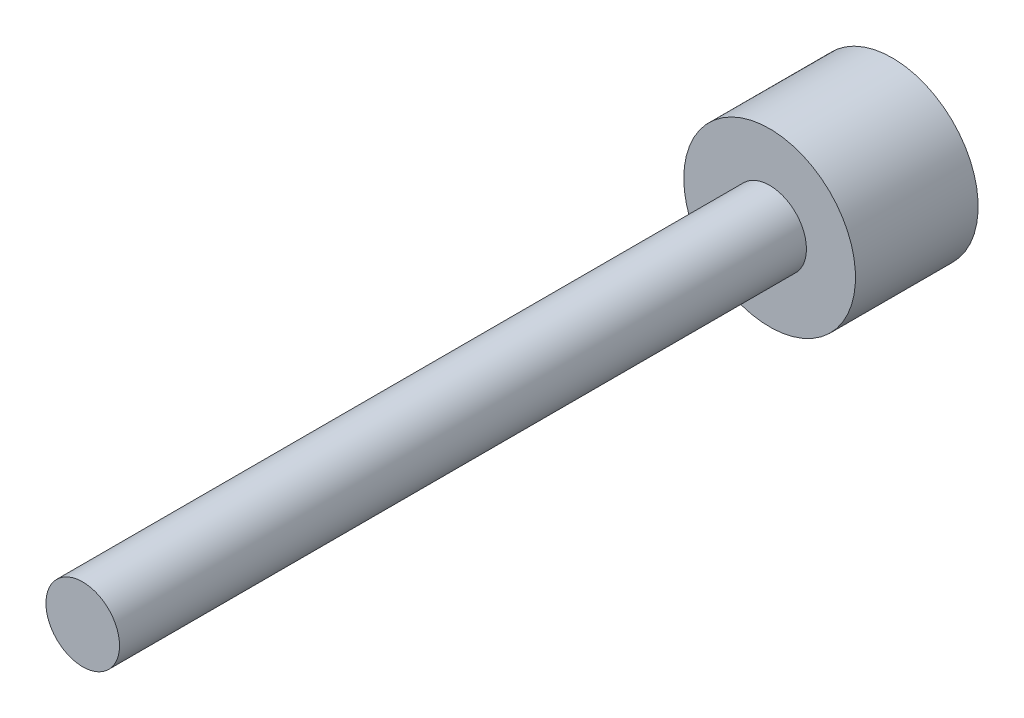
ISO-10303-21;
HEADER;
FILE_DESCRIPTION(('STEP AP214'),'2;1');
FILE_NAME('part.step','',(''),(''),'','','');
FILE_SCHEMA(('AUTOMOTIVE_DESIGN { 1 0 10303 214 1 1 1 1 }'));
ENDSEC;
DATA;
#1=APPLICATION_CONTEXT('core data for automotive mechanical design processes');
#2=APPLICATION_PROTOCOL_DEFINITION('international standard','automotive_design',2000,#1);
#3=PRODUCT_CONTEXT('',#1,'mechanical');
#4=PRODUCT('Part','Part','',(#3));
#5=PRODUCT_RELATED_PRODUCT_CATEGORY('part','',(#4));
#6=PRODUCT_DEFINITION_FORMATION('','',#4);
#7=PRODUCT_DEFINITION_CONTEXT('part definition',#1,'design');
#8=PRODUCT_DEFINITION('design','',#6,#7);
#9=PRODUCT_DEFINITION_SHAPE('','',#8);
#10=(LENGTH_UNIT() NAMED_UNIT(*) SI_UNIT(.MILLI.,.METRE.));
#11=(NAMED_UNIT(*) PLANE_ANGLE_UNIT() SI_UNIT($,.RADIAN.));
#12=(NAMED_UNIT(*) SI_UNIT($,.STERADIAN.) SOLID_ANGLE_UNIT());
#13=UNCERTAINTY_MEASURE_WITH_UNIT(LENGTH_MEASURE(1.E-05),#10,'distance_accuracy_value','');
#14=(GEOMETRIC_REPRESENTATION_CONTEXT(3) GLOBAL_UNCERTAINTY_ASSIGNED_CONTEXT((#13)) GLOBAL_UNIT_ASSIGNED_CONTEXT((#10,
#11,#12)) REPRESENTATION_CONTEXT('',''));
#15=CARTESIAN_POINT('',(0.,0.,0.));
#16=DIRECTION('',(0.,0.,1.));
#17=DIRECTION('',(1.,0.,0.));
#18=AXIS2_PLACEMENT_3D('',#15,#16,#17);
#19=CARTESIAN_POINT('',(0.,0.,28.));
#20=DIRECTION('',(0.,0.,-1.));
#21=DIRECTION('',(-1.,0.,0.));
#22=AXIS2_PLACEMENT_3D('',#19,#20,#21);
#23=CYLINDRICAL_SURFACE('',#22,1.5);
#24=CARTESIAN_POINT('',(0.,0.,28.));
#25=DIRECTION('',(0.,0.,1.));
#26=DIRECTION('',(1.,0.,0.));
#27=AXIS2_PLACEMENT_3D('',#24,#25,#26);
#28=CIRCLE('',#27,1.5);
#29=CARTESIAN_POINT('',(1.5,0.,28.));
#30=VERTEX_POINT('',#29);
#31=EDGE_CURVE('E10',#30,#30,#28,.T.);
#32=ORIENTED_EDGE('',*,*,#31,.F.);
#33=EDGE_LOOP('',(#32));
#34=FACE_BOUND('',#33,.T.);
#35=CARTESIAN_POINT('',(0.,0.,0.));
#36=DIRECTION('',(0.,0.,1.));
#37=DIRECTION('',(1.,0.,0.));
#38=AXIS2_PLACEMENT_3D('',#35,#36,#37);
#39=CIRCLE('',#38,1.5);
#40=CARTESIAN_POINT('',(1.5,0.,0.));
#41=VERTEX_POINT('',#40);
#42=EDGE_CURVE('E34',#41,#41,#39,.T.);
#43=ORIENTED_EDGE('',*,*,#42,.T.);
#44=EDGE_LOOP('',(#43));
#45=FACE_BOUND('',#44,.T.);
#46=ADVANCED_FACE('F31',(#34,#45),#23,.T.);
#47=CARTESIAN_POINT('',(0.,0.,28.));
#48=DIRECTION('',(0.,0.,1.));
#49=DIRECTION('',(1.,0.,0.));
#50=AXIS2_PLACEMENT_3D('',#47,#48,#49);
#51=PLANE('',#50);
#52=ORIENTED_EDGE('',*,*,#31,.T.);
#53=EDGE_LOOP('',(#52));
#54=FACE_BOUND('',#53,.T.);
#55=ADVANCED_FACE('F54',(#54),#51,.T.);
#56=CARTESIAN_POINT('',(0.,0.,-5.));
#57=DIRECTION('',(0.,0.,1.));
#58=DIRECTION('',(1.,0.,0.));
#59=AXIS2_PLACEMENT_3D('',#56,#57,#58);
#60=CYLINDRICAL_SURFACE('',#59,3.5);
#61=CARTESIAN_POINT('',(0.,0.,-5.));
#62=DIRECTION('',(0.,0.,-1.));
#63=DIRECTION('',(-1.,0.,0.));
#64=AXIS2_PLACEMENT_3D('',#61,#62,#63);
#65=CIRCLE('',#64,3.5);
#66=CARTESIAN_POINT('',(-3.5,0.,-5.));
#67=VERTEX_POINT('',#66);
#68=EDGE_CURVE('E41',#67,#67,#65,.T.);
#69=ORIENTED_EDGE('',*,*,#68,.F.);
#70=EDGE_LOOP('',(#69));
#71=FACE_BOUND('',#70,.T.);
#72=CARTESIAN_POINT('',(0.,0.,0.));
#73=DIRECTION('',(0.,0.,-1.));
#74=DIRECTION('',(-1.,0.,0.));
#75=AXIS2_PLACEMENT_3D('',#72,#73,#74);
#76=CIRCLE('',#75,3.5);
#77=CARTESIAN_POINT('',(-3.5,0.,0.));
#78=VERTEX_POINT('',#77);
#79=EDGE_CURVE('E43',#78,#78,#76,.T.);
#80=ORIENTED_EDGE('',*,*,#79,.T.);
#81=EDGE_LOOP('',(#80));
#82=FACE_BOUND('',#81,.T.);
#83=ADVANCED_FACE('F51',(#71,#82),#60,.T.);
#84=CARTESIAN_POINT('',(0.,0.,-5.));
#85=DIRECTION('',(0.,0.,-1.));
#86=DIRECTION('',(-1.,0.,0.));
#87=AXIS2_PLACEMENT_3D('',#84,#85,#86);
#88=PLANE('',#87);
#89=ORIENTED_EDGE('',*,*,#68,.T.);
#90=EDGE_LOOP('',(#89));
#91=FACE_BOUND('',#90,.T.);
#92=ADVANCED_FACE('F49',(#91),#88,.T.);
#93=CARTESIAN_POINT('',(0.,0.,0.));
#94=DIRECTION('',(0.,0.,-1.));
#95=DIRECTION('',(-1.,0.,0.));
#96=AXIS2_PLACEMENT_3D('',#93,#94,#95);
#97=PLANE('',#96);
#98=ORIENTED_EDGE('',*,*,#42,.F.);
#99=EDGE_LOOP('',(#98));
#100=FACE_BOUND('',#99,.T.);
#101=ORIENTED_EDGE('',*,*,#79,.F.);
#102=EDGE_LOOP('',(#101));
#103=FACE_BOUND('',#102,.T.);
#104=ADVANCED_FACE('F58',(#100,#103),#97,.F.);
#105=CLOSED_SHELL('',(#46,#55,#83,#92,#104));
#106=MANIFOLD_SOLID_BREP('B2',#105);
#107=ADVANCED_BREP_SHAPE_REPRESENTATION('',(#18,#106),#14);
#108=SHAPE_DEFINITION_REPRESENTATION(#9,#107);
ENDSEC;
END-ISO-10303-21;
